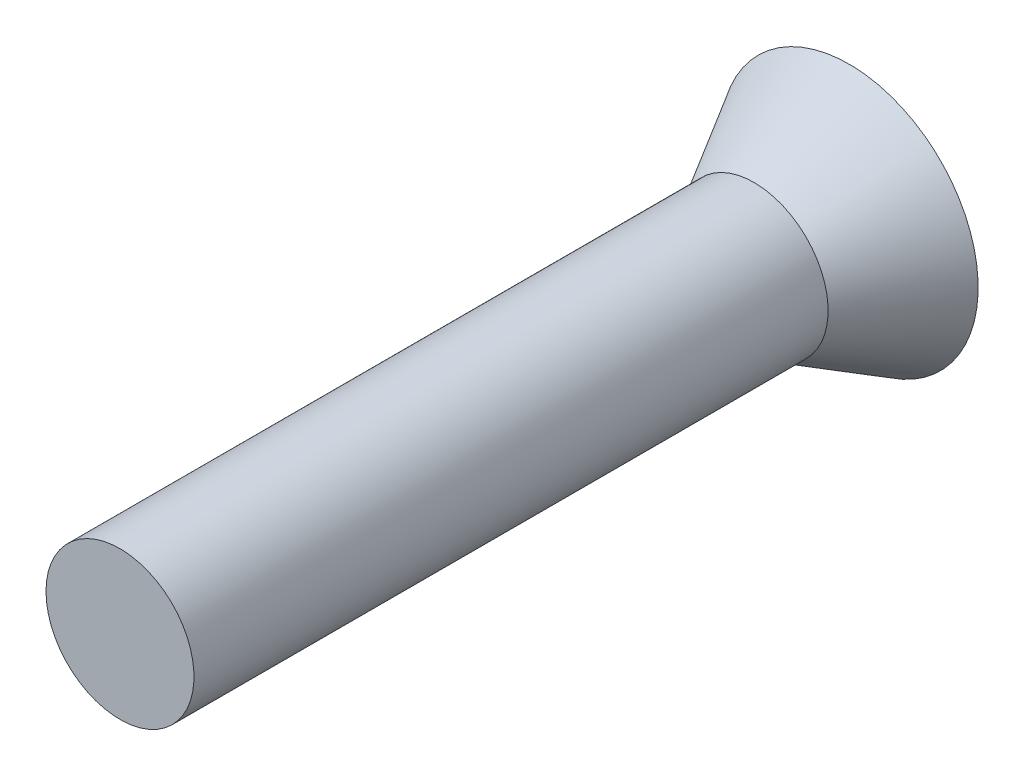
ISO-10303-21;
HEADER;
FILE_DESCRIPTION(('STEP AP214'),'2;1');
FILE_NAME('part.step','',(''),(''),'','','');
FILE_SCHEMA(('AUTOMOTIVE_DESIGN { 1 0 10303 214 1 1 1 1 }'));
ENDSEC;
DATA;
#1=APPLICATION_CONTEXT('core data for automotive mechanical design processes');
#2=APPLICATION_PROTOCOL_DEFINITION('international standard','automotive_design',2000,#1);
#3=PRODUCT_CONTEXT('',#1,'mechanical');
#4=PRODUCT('Part','Part','',(#3));
#5=PRODUCT_RELATED_PRODUCT_CATEGORY('part','',(#4));
#6=PRODUCT_DEFINITION_FORMATION('','',#4);
#7=PRODUCT_DEFINITION_CONTEXT('part definition',#1,'design');
#8=PRODUCT_DEFINITION('design','',#6,#7);
#9=PRODUCT_DEFINITION_SHAPE('','',#8);
#10=(LENGTH_UNIT() NAMED_UNIT(*) SI_UNIT(.MILLI.,.METRE.));
#11=(NAMED_UNIT(*) PLANE_ANGLE_UNIT() SI_UNIT($,.RADIAN.));
#12=(NAMED_UNIT(*) SI_UNIT($,.STERADIAN.) SOLID_ANGLE_UNIT());
#13=UNCERTAINTY_MEASURE_WITH_UNIT(LENGTH_MEASURE(1.E-05),#10,'distance_accuracy_value','');
#14=(GEOMETRIC_REPRESENTATION_CONTEXT(3) GLOBAL_UNCERTAINTY_ASSIGNED_CONTEXT((#13)) GLOBAL_UNIT_ASSIGNED_CONTEXT((#10,
#11,#12)) REPRESENTATION_CONTEXT('',''));
#15=CARTESIAN_POINT('',(0.,0.,0.));
#16=DIRECTION('',(0.,0.,1.));
#17=DIRECTION('',(1.,0.,0.));
#18=AXIS2_PLACEMENT_3D('',#15,#16,#17);
#19=CARTESIAN_POINT('',(-0.699999999999994,0.,1.));
#20=DIRECTION('',(0.,0.,1.));
#21=DIRECTION('',(1.,0.,0.));
#22=AXIS2_PLACEMENT_3D('',#19,#20,#21);
#23=PLANE('',#22);
#24=CARTESIAN_POINT('',(0.,0.,1.));
#25=DIRECTION('',(0.,0.,-1.));
#26=DIRECTION('',(-1.,0.,0.));
#27=AXIS2_PLACEMENT_3D('',#24,#25,#26);
#28=CIRCLE('',#27,0.699999999999994);
#29=CARTESIAN_POINT('',(-0.699999999999994,0.,1.));
#30=VERTEX_POINT('',#29);
#31=EDGE_CURVE('E247',#30,#30,#28,.T.);
#32=ORIENTED_EDGE('',*,*,#31,.F.);
#33=EDGE_LOOP('',(#32));
#34=FACE_BOUND('',#33,.T.);
#35=ADVANCED_FACE('F35',(#34),#23,.T.);
#36=CARTESIAN_POINT('',(0.,0.,-5.9));
#37=DIRECTION('',(0.,0.,-1.));
#38=DIRECTION('',(-1.,0.,0.));
#39=AXIS2_PLACEMENT_3D('',#36,#37,#38);
#40=PLANE('',#39);
#41=DIRECTION('',(0.,-1.,0.));
#42=VECTOR('',#41,1.);
#43=CARTESIAN_POINT('',(0.196763202725732,-0.196763202725732,-5.9));
#44=LINE('',#43,#42);
#45=CARTESIAN_POINT('',(0.196763202725732,-0.296763202725732,-5.9));
#46=VERTEX_POINT('',#45);
#47=CARTESIAN_POINT('',(0.196763202725732,-0.650000000000001,-5.9));
#48=VERTEX_POINT('',#47);
#49=EDGE_CURVE('E213',#46,#48,#44,.T.);
#50=ORIENTED_EDGE('',*,*,#49,.F.);
#51=DIRECTION('',(-0.707106781186551,-0.707106781186544,0.));
#52=VECTOR('',#51,1.);
#53=CARTESIAN_POINT('',(0.246763202725733,-0.246763202725731,-5.9));
#54=LINE('',#53,#52);
#55=CARTESIAN_POINT('',(0.296763202725733,-0.196763202725732,-5.9));
#56=VERTEX_POINT('',#55);
#57=EDGE_CURVE('E196',#46,#56,#54,.F.);
#58=ORIENTED_EDGE('',*,*,#57,.T.);
#59=DIRECTION('',(-1.,0.,0.));
#60=VECTOR('',#59,1.);
#61=CARTESIAN_POINT('',(0.75,-0.196763202725732,-5.9));
#62=LINE('',#61,#60);
#63=CARTESIAN_POINT('',(0.65,-0.196763202725732,-5.9));
#64=VERTEX_POINT('',#63);
#65=EDGE_CURVE('E225',#64,#56,#62,.T.);
#66=ORIENTED_EDGE('',*,*,#65,.F.);
#67=DIRECTION('',(-0.707106781186554,-0.707106781186541,0.));
#68=VECTOR('',#67,1.);
#69=CARTESIAN_POINT('',(0.65,-0.196763202725732,-5.9));
#70=LINE('',#69,#68);
#71=CARTESIAN_POINT('',(0.75,-0.096763202725733,-5.9));
#72=VERTEX_POINT('',#71);
#73=EDGE_CURVE('E317',#64,#72,#70,.F.);
#74=ORIENTED_EDGE('',*,*,#73,.T.);
#75=DIRECTION('',(0.,-1.,0.));
#76=VECTOR('',#75,1.);
#77=CARTESIAN_POINT('',(0.75,0.196763202725732,-5.9));
#78=LINE('',#77,#76);
#79=CARTESIAN_POINT('',(0.75,0.0967632027257305,-5.9));
#80=VERTEX_POINT('',#79);
#81=EDGE_CURVE('E230',#80,#72,#78,.T.);
#82=ORIENTED_EDGE('',*,*,#81,.F.);
#83=DIRECTION('',(0.707106781186541,-0.707106781186554,0.));
#84=VECTOR('',#83,1.);
#85=CARTESIAN_POINT('',(0.75,0.0967632027257305,-5.9));
#86=LINE('',#85,#84);
#87=CARTESIAN_POINT('',(0.650000000000001,0.196763202725732,-5.9));
#88=VERTEX_POINT('',#87);
#89=EDGE_CURVE('E320',#80,#88,#86,.F.);
#90=ORIENTED_EDGE('',*,*,#89,.T.);
#91=DIRECTION('',(1.,0.,0.));
#92=VECTOR('',#91,1.);
#93=CARTESIAN_POINT('',(0.196763202725732,0.196763202725732,-5.9));
#94=LINE('',#93,#92);
#95=CARTESIAN_POINT('',(0.296763202725731,0.196763202725732,-5.9));
#96=VERTEX_POINT('',#95);
#97=EDGE_CURVE('E377',#96,#88,#94,.T.);
#98=ORIENTED_EDGE('',*,*,#97,.F.);
#99=DIRECTION('',(0.707106781186545,-0.70710678118655,0.));
#100=VECTOR('',#99,1.);
#101=CARTESIAN_POINT('',(0.246763202725735,0.246763202725728,-5.9));
#102=LINE('',#101,#100);
#103=CARTESIAN_POINT('',(0.196763202725732,0.296763202725731,-5.9));
#104=VERTEX_POINT('',#103);
#105=EDGE_CURVE('E217',#96,#104,#102,.F.);
#106=ORIENTED_EDGE('',*,*,#105,.T.);
#107=DIRECTION('',(0.,-1.,0.));
#108=VECTOR('',#107,1.);
#109=CARTESIAN_POINT('',(0.196763202725732,0.75,-5.9));
#110=LINE('',#109,#108);
#111=CARTESIAN_POINT('',(0.196763202725732,0.649999999999999,-5.9));
#112=VERTEX_POINT('',#111);
#113=EDGE_CURVE('E374',#112,#104,#110,.T.);
#114=ORIENTED_EDGE('',*,*,#113,.F.);
#115=DIRECTION('',(0.707106781186545,-0.707106781186551,0.));
#116=VECTOR('',#115,1.);
#117=CARTESIAN_POINT('',(0.196763202725732,0.649999999999999,-5.9));
#118=LINE('',#117,#116);
#119=CARTESIAN_POINT('',(0.0967632027257316,0.75,-5.9));
#120=VERTEX_POINT('',#119);
#121=EDGE_CURVE('E322',#112,#120,#118,.F.);
#122=ORIENTED_EDGE('',*,*,#121,.T.);
#123=DIRECTION('',(1.,0.,0.));
#124=VECTOR('',#123,1.);
#125=CARTESIAN_POINT('',(0.,0.75,-5.9));
#126=LINE('',#125,#124);
#127=CARTESIAN_POINT('',(-0.0967632027257307,0.75,-5.9));
#128=VERTEX_POINT('',#127);
#129=EDGE_CURVE('E373',#128,#120,#126,.T.);
#130=ORIENTED_EDGE('',*,*,#129,.F.);
#131=DIRECTION('',(0.707106781186554,0.707106781186541,0.));
#132=VECTOR('',#131,1.);
#133=CARTESIAN_POINT('',(-0.0967632027257307,0.75,-5.9));
#134=LINE('',#133,#132);
#135=CARTESIAN_POINT('',(-0.196763202725732,0.650000000000001,-5.9));
#136=VERTEX_POINT('',#135);
#137=EDGE_CURVE('E325',#128,#136,#134,.F.);
#138=ORIENTED_EDGE('',*,*,#137,.T.);
#139=DIRECTION('',(0.,1.,0.));
#140=VECTOR('',#139,1.);
#141=CARTESIAN_POINT('',(-0.196763202725732,0.196763202725732,-5.9));
#142=LINE('',#141,#140);
#143=CARTESIAN_POINT('',(-0.196763202725732,0.296763202725731,-5.9));
#144=VERTEX_POINT('',#143);
#145=EDGE_CURVE('E243',#144,#136,#142,.T.);
#146=ORIENTED_EDGE('',*,*,#145,.F.);
#147=DIRECTION('',(0.707106781186554,0.707106781186541,0.));
#148=VECTOR('',#147,1.);
#149=CARTESIAN_POINT('',(-0.246763202725727,0.246763202725737,-5.9));
#150=LINE('',#149,#148);
#151=CARTESIAN_POINT('',(-0.296763202725733,0.196763202725732,-5.9));
#152=VERTEX_POINT('',#151);
#153=EDGE_CURVE('E258',#144,#152,#150,.F.);
#154=ORIENTED_EDGE('',*,*,#153,.T.);
#155=DIRECTION('',(1.,0.,0.));
#156=VECTOR('',#155,1.);
#157=CARTESIAN_POINT('',(-0.75,0.196763202725732,-5.9));
#158=LINE('',#157,#156);
#159=CARTESIAN_POINT('',(-0.649999999999999,0.196763202725732,-5.9));
#160=VERTEX_POINT('',#159);
#161=EDGE_CURVE('E241',#160,#152,#158,.T.);
#162=ORIENTED_EDGE('',*,*,#161,.F.);
#163=DIRECTION('',(0.707106781186554,0.707106781186541,0.));
#164=VECTOR('',#163,1.);
#165=CARTESIAN_POINT('',(-0.649999999999999,0.196763202725732,-5.9));
#166=LINE('',#165,#164);
#167=CARTESIAN_POINT('',(-0.75,0.0967632027257323,-5.9));
#168=VERTEX_POINT('',#167);
#169=EDGE_CURVE('E308',#160,#168,#166,.F.);
#170=ORIENTED_EDGE('',*,*,#169,.T.);
#171=DIRECTION('',(0.,1.,0.));
#172=VECTOR('',#171,1.);
#173=CARTESIAN_POINT('',(-0.75,-0.196763202725732,-5.9));
#174=LINE('',#173,#172);
#175=CARTESIAN_POINT('',(-0.75,-0.0967632027257307,-5.9));
#176=VERTEX_POINT('',#175);
#177=EDGE_CURVE('E238',#176,#168,#174,.T.);
#178=ORIENTED_EDGE('',*,*,#177,.F.);
#179=DIRECTION('',(-0.707106781186544,0.707106781186551,0.));
#180=VECTOR('',#179,1.);
#181=CARTESIAN_POINT('',(-0.75,-0.0967632027257307,-5.9));
#182=LINE('',#181,#180);
#183=CARTESIAN_POINT('',(-0.65,-0.196763202725732,-5.9));
#184=VERTEX_POINT('',#183);
#185=EDGE_CURVE('E311',#176,#184,#182,.F.);
#186=ORIENTED_EDGE('',*,*,#185,.T.);
#187=DIRECTION('',(-1.,0.,0.));
#188=VECTOR('',#187,1.);
#189=CARTESIAN_POINT('',(-0.196763202725732,-0.196763202725732,-5.9));
#190=LINE('',#189,#188);
#191=CARTESIAN_POINT('',(-0.296763202725731,-0.196763202725732,-5.9));
#192=VERTEX_POINT('',#191);
#193=EDGE_CURVE('E235',#192,#184,#190,.T.);
#194=ORIENTED_EDGE('',*,*,#193,.F.);
#195=DIRECTION('',(-0.707106781186544,0.707106781186551,0.));
#196=VECTOR('',#195,1.);
#197=CARTESIAN_POINT('',(-0.24676320272573,-0.246763202725733,-5.9));
#198=LINE('',#197,#196);
#199=CARTESIAN_POINT('',(-0.196763202725732,-0.296763202725732,-5.9));
#200=VERTEX_POINT('',#199);
#201=EDGE_CURVE('E206',#192,#200,#198,.F.);
#202=ORIENTED_EDGE('',*,*,#201,.T.);
#203=DIRECTION('',(0.,1.,0.));
#204=VECTOR('',#203,1.);
#205=CARTESIAN_POINT('',(-0.196763202725732,-0.75,-5.9));
#206=LINE('',#205,#204);
#207=CARTESIAN_POINT('',(-0.196763202725732,-0.649999999999999,-5.9));
#208=VERTEX_POINT('',#207);
#209=EDGE_CURVE('E228',#208,#200,#206,.T.);
#210=ORIENTED_EDGE('',*,*,#209,.F.);
#211=DIRECTION('',(-0.707106781186544,0.707106781186551,0.));
#212=VECTOR('',#211,1.);
#213=CARTESIAN_POINT('',(-0.196763202725732,-0.649999999999999,-5.9));
#214=LINE('',#213,#212);
#215=CARTESIAN_POINT('',(-0.0967632027257316,-0.75,-5.9));
#216=VERTEX_POINT('',#215);
#217=EDGE_CURVE('E313',#208,#216,#214,.F.);
#218=ORIENTED_EDGE('',*,*,#217,.T.);
#219=DIRECTION('',(-1.,0.,0.));
#220=VECTOR('',#219,1.);
#221=CARTESIAN_POINT('',(0.196763202725732,-0.75,-5.9));
#222=LINE('',#221,#220);
#223=CARTESIAN_POINT('',(0.0967632027257308,-0.75,-5.9));
#224=VERTEX_POINT('',#223);
#225=EDGE_CURVE('E224',#224,#216,#222,.T.);
#226=ORIENTED_EDGE('',*,*,#225,.F.);
#227=DIRECTION('',(-0.707106781186554,-0.707106781186541,0.));
#228=VECTOR('',#227,1.);
#229=CARTESIAN_POINT('',(0.0967632027257308,-0.75,-5.9));
#230=LINE('',#229,#228);
#231=EDGE_CURVE('E223',#224,#48,#230,.F.);
#232=ORIENTED_EDGE('',*,*,#231,.T.);
#233=EDGE_LOOP('',(#50,#58,#66,#74,#82,#90,#98,#106,#114,#122,#130,#138,#146,#154,#162,#170,
#178,#186,#194,#202,#210,#218,#226,#232));
#234=FACE_BOUND('',#233,.T.);
#235=CARTESIAN_POINT('',(0.,0.,-5.9));
#236=DIRECTION('',(0.,0.,-1.));
#237=DIRECTION('',(-1.,0.,0.));
#238=AXIS2_PLACEMENT_3D('',#235,#236,#237);
#239=CIRCLE('',#238,1.21961524227065);
#240=CARTESIAN_POINT('',(-1.21961524227065,0.,-5.9));
#241=VERTEX_POINT('',#240);
#242=EDGE_CURVE('E218',#241,#241,#239,.T.);
#243=ORIENTED_EDGE('',*,*,#242,.T.);
#244=EDGE_LOOP('',(#243));
#245=FACE_BOUND('',#244,.T.);
#246=ADVANCED_FACE('F220',(#234,#245),#40,.T.);
#247=CARTESIAN_POINT('',(0.,0.,-5.9));
#248=DIRECTION('',(0.,0.,-1.));
#249=DIRECTION('',(-1.,0.,0.));
#250=AXIS2_PLACEMENT_3D('',#247,#248,#249);
#251=CONICAL_SURFACE('',#250,1.21961524227065,0.523598775598291);
#252=CARTESIAN_POINT('',(0.,0.,-5.));
#253=DIRECTION('',(0.,0.,-1.));
#254=DIRECTION('',(-1.,0.,0.));
#255=AXIS2_PLACEMENT_3D('',#252,#253,#254);
#256=CIRCLE('',#255,0.699999999999994);
#257=CARTESIAN_POINT('',(-0.699999999999994,0.,-5.));
#258=VERTEX_POINT('',#257);
#259=EDGE_CURVE('E250',#258,#258,#256,.T.);
#260=ORIENTED_EDGE('',*,*,#259,.T.);
#261=EDGE_LOOP('',(#260));
#262=FACE_BOUND('',#261,.T.);
#263=ORIENTED_EDGE('',*,*,#242,.F.);
#264=EDGE_LOOP('',(#263));
#265=FACE_BOUND('',#264,.T.);
#266=ADVANCED_FACE('F488',(#262,#265),#251,.T.);
#267=CARTESIAN_POINT('',(0.,0.,-52.449576884311));
#268=DIRECTION('',(0.,0.,-1.));
#269=DIRECTION('',(-1.,0.,0.));
#270=AXIS2_PLACEMENT_3D('',#267,#268,#269);
#271=CYLINDRICAL_SURFACE('',#270,0.699999999999994);
#272=ORIENTED_EDGE('',*,*,#31,.T.);
#273=EDGE_LOOP('',(#272));
#274=FACE_BOUND('',#273,.T.);
#275=ORIENTED_EDGE('',*,*,#259,.F.);
#276=EDGE_LOOP('',(#275));
#277=FACE_BOUND('',#276,.T.);
#278=ADVANCED_FACE('F597',(#274,#277),#271,.T.);
#279=CARTESIAN_POINT('',(-0.196763202725732,0.196763202725732,-5.65));
#280=DIRECTION('',(-1.,0.,0.));
#281=DIRECTION('',(0.,-1.,0.));
#282=AXIS2_PLACEMENT_3D('',#279,#280,#281);
#283=PLANE('',#282);
#284=DIRECTION('',(0.,0.,1.));
#285=VECTOR('',#284,1.);
#286=CARTESIAN_POINT('',(-0.196763202725732,0.650000000000001,-5.65));
#287=LINE('',#286,#285);
#288=CARTESIAN_POINT('',(-0.196763202725732,0.650000000000001,-5.8));
#289=VERTEX_POINT('',#288);
#290=EDGE_CURVE('E306',#136,#289,#287,.T.);
#291=ORIENTED_EDGE('',*,*,#290,.T.);
#292=DIRECTION('',(0.,-0.707106781186551,0.707106781186544));
#293=VECTOR('',#292,1.);
#294=CARTESIAN_POINT('',(-0.196763202725732,0.499999999999998,-5.65));
#295=LINE('',#294,#293);
#296=CARTESIAN_POINT('',(-0.196763202725732,0.499999999999998,-5.65));
#297=VERTEX_POINT('',#296);
#298=EDGE_CURVE('E11',#289,#297,#295,.T.);
#299=ORIENTED_EDGE('',*,*,#298,.T.);
#300=DIRECTION('',(0.,1.,0.));
#301=VECTOR('',#300,1.);
#302=CARTESIAN_POINT('',(-0.196763202725732,0.196763202725732,-5.65));
#303=LINE('',#302,#301);
#304=CARTESIAN_POINT('',(-0.196763202725732,0.296763202725731,-5.65));
#305=VERTEX_POINT('',#304);
#306=EDGE_CURVE('E251',#305,#297,#303,.T.);
#307=ORIENTED_EDGE('',*,*,#306,.F.);
#308=DIRECTION('',(0.,0.,-1.));
#309=VECTOR('',#308,1.);
#310=CARTESIAN_POINT('',(-0.196763202725732,0.296763202725731,-5.65));
#311=LINE('',#310,#309);
#312=EDGE_CURVE('E270',#305,#144,#311,.T.);
#313=ORIENTED_EDGE('',*,*,#312,.T.);
#314=ORIENTED_EDGE('',*,*,#145,.T.);
#315=EDGE_LOOP('',(#291,#299,#307,#313,#314));
#316=FACE_BOUND('',#315,.T.);
#317=ADVANCED_FACE('F425',(#316),#283,.F.);
#318=CARTESIAN_POINT('',(-0.75,0.196763202725732,-5.65));
#319=DIRECTION('',(0.,1.,0.));
#320=DIRECTION('',(-1.,0.,0.));
#321=AXIS2_PLACEMENT_3D('',#318,#319,#320);
#322=PLANE('',#321);
#323=DIRECTION('',(1.,0.,0.));
#324=VECTOR('',#323,1.);
#325=CARTESIAN_POINT('',(-0.75,0.196763202725732,-5.65));
#326=LINE('',#325,#324);
#327=CARTESIAN_POINT('',(-0.499999999999998,0.196763202725732,-5.65));
#328=VERTEX_POINT('',#327);
#329=CARTESIAN_POINT('',(-0.296763202725733,0.196763202725732,-5.65));
#330=VERTEX_POINT('',#329);
#331=EDGE_CURVE('E417',#328,#330,#326,.T.);
#332=ORIENTED_EDGE('',*,*,#331,.F.);
#333=DIRECTION('',(-0.707106781186551,0.,-0.707106781186544));
#334=VECTOR('',#333,1.);
#335=CARTESIAN_POINT('',(-0.499999999999998,0.196763202725732,-5.65));
#336=LINE('',#335,#334);
#337=CARTESIAN_POINT('',(-0.649999999999999,0.196763202725732,-5.8));
#338=VERTEX_POINT('',#337);
#339=EDGE_CURVE('E355',#328,#338,#336,.T.);
#340=ORIENTED_EDGE('',*,*,#339,.T.);
#341=DIRECTION('',(0.,0.,-1.));
#342=VECTOR('',#341,1.);
#343=CARTESIAN_POINT('',(-0.649999999999999,0.196763202725732,-5.9));
#344=LINE('',#343,#342);
#345=EDGE_CURVE('E290',#338,#160,#344,.T.);
#346=ORIENTED_EDGE('',*,*,#345,.T.);
#347=ORIENTED_EDGE('',*,*,#161,.T.);
#348=DIRECTION('',(0.,0.,1.));
#349=VECTOR('',#348,1.);
#350=CARTESIAN_POINT('',(-0.296763202725733,0.196763202725732,-5.65));
#351=LINE('',#350,#349);
#352=EDGE_CURVE('E273',#152,#330,#351,.T.);
#353=ORIENTED_EDGE('',*,*,#352,.T.);
#354=EDGE_LOOP('',(#332,#340,#346,#347,#353));
#355=FACE_BOUND('',#354,.T.);
#356=ADVANCED_FACE('F433',(#355),#322,.F.);
#357=CARTESIAN_POINT('',(-0.196763202725732,-0.196763202725732,-5.65));
#358=DIRECTION('',(0.,-1.,0.));
#359=DIRECTION('',(1.,0.,0.));
#360=AXIS2_PLACEMENT_3D('',#357,#358,#359);
#361=PLANE('',#360);
#362=DIRECTION('',(0.,0.,1.));
#363=VECTOR('',#362,1.);
#364=CARTESIAN_POINT('',(-0.65,-0.196763202725732,-5.65));
#365=LINE('',#364,#363);
#366=CARTESIAN_POINT('',(-0.65,-0.196763202725732,-5.8));
#367=VERTEX_POINT('',#366);
#368=EDGE_CURVE('E292',#184,#367,#365,.T.);
#369=ORIENTED_EDGE('',*,*,#368,.T.);
#370=DIRECTION('',(0.707106781186551,0.,0.707106781186544));
#371=VECTOR('',#370,1.);
#372=CARTESIAN_POINT('',(-0.499999999999998,-0.196763202725732,-5.65));
#373=LINE('',#372,#371);
#374=CARTESIAN_POINT('',(-0.499999999999998,-0.196763202725732,-5.65));
#375=VERTEX_POINT('',#374);
#376=EDGE_CURVE('E361',#367,#375,#373,.T.);
#377=ORIENTED_EDGE('',*,*,#376,.T.);
#378=DIRECTION('',(-1.,0.,0.));
#379=VECTOR('',#378,1.);
#380=CARTESIAN_POINT('',(-0.196763202725732,-0.196763202725732,-5.65));
#381=LINE('',#380,#379);
#382=CARTESIAN_POINT('',(-0.296763202725731,-0.196763202725732,-5.65));
#383=VERTEX_POINT('',#382);
#384=EDGE_CURVE('E415',#383,#375,#381,.T.);
#385=ORIENTED_EDGE('',*,*,#384,.F.);
#386=DIRECTION('',(0.,0.,-1.));
#387=VECTOR('',#386,1.);
#388=CARTESIAN_POINT('',(-0.296763202725731,-0.196763202725732,-5.65));
#389=LINE('',#388,#387);
#390=EDGE_CURVE('E264',#383,#192,#389,.T.);
#391=ORIENTED_EDGE('',*,*,#390,.T.);
#392=ORIENTED_EDGE('',*,*,#193,.T.);
#393=EDGE_LOOP('',(#369,#377,#385,#391,#392));
#394=FACE_BOUND('',#393,.T.);
#395=ADVANCED_FACE('F449',(#394),#361,.F.);
#396=CARTESIAN_POINT('',(-0.196763202725732,-0.75,-5.65));
#397=DIRECTION('',(-1.,0.,0.));
#398=DIRECTION('',(0.,-1.,0.));
#399=AXIS2_PLACEMENT_3D('',#396,#397,#398);
#400=PLANE('',#399);
#401=DIRECTION('',(0.,1.,0.));
#402=VECTOR('',#401,1.);
#403=CARTESIAN_POINT('',(-0.196763202725732,-0.75,-5.65));
#404=LINE('',#403,#402);
#405=CARTESIAN_POINT('',(-0.196763202725732,-0.499999999999998,-5.65));
#406=VERTEX_POINT('',#405);
#407=CARTESIAN_POINT('',(-0.196763202725732,-0.296763202725732,-5.65));
#408=VERTEX_POINT('',#407);
#409=EDGE_CURVE('E413',#406,#408,#404,.T.);
#410=ORIENTED_EDGE('',*,*,#409,.F.);
#411=DIRECTION('',(0.,-0.707106781186551,-0.707106781186544));
#412=VECTOR('',#411,1.);
#413=CARTESIAN_POINT('',(-0.196763202725732,-0.499999999999998,-5.65));
#414=LINE('',#413,#412);
#415=CARTESIAN_POINT('',(-0.196763202725732,-0.649999999999999,-5.8));
#416=VERTEX_POINT('',#415);
#417=EDGE_CURVE('E339',#406,#416,#414,.T.);
#418=ORIENTED_EDGE('',*,*,#417,.T.);
#419=DIRECTION('',(0.,0.,-1.));
#420=VECTOR('',#419,1.);
#421=CARTESIAN_POINT('',(-0.196763202725732,-0.649999999999999,-5.9));
#422=LINE('',#421,#420);
#423=EDGE_CURVE('E295',#416,#208,#422,.T.);
#424=ORIENTED_EDGE('',*,*,#423,.T.);
#425=ORIENTED_EDGE('',*,*,#209,.T.);
#426=DIRECTION('',(0.,0.,1.));
#427=VECTOR('',#426,1.);
#428=CARTESIAN_POINT('',(-0.196763202725732,-0.296763202725732,-5.65));
#429=LINE('',#428,#427);
#430=EDGE_CURVE('E267',#200,#408,#429,.T.);
#431=ORIENTED_EDGE('',*,*,#430,.T.);
#432=EDGE_LOOP('',(#410,#418,#424,#425,#431));
#433=FACE_BOUND('',#432,.T.);
#434=ADVANCED_FACE('F460',(#433),#400,.F.);
#435=CARTESIAN_POINT('',(0.196763202725732,-0.196763202725732,-5.65));
#436=DIRECTION('',(1.,0.,0.));
#437=DIRECTION('',(0.,1.,0.));
#438=AXIS2_PLACEMENT_3D('',#435,#436,#437);
#439=PLANE('',#438);
#440=DIRECTION('',(0.,0.,1.));
#441=VECTOR('',#440,1.);
#442=CARTESIAN_POINT('',(0.196763202725732,-0.650000000000001,-5.65));
#443=LINE('',#442,#441);
#444=CARTESIAN_POINT('',(0.196763202725732,-0.650000000000001,-5.8));
#445=VERTEX_POINT('',#444);
#446=EDGE_CURVE('E297',#48,#445,#443,.T.);
#447=ORIENTED_EDGE('',*,*,#446,.T.);
#448=DIRECTION('',(0.,0.707106781186551,0.707106781186544));
#449=VECTOR('',#448,1.);
#450=CARTESIAN_POINT('',(0.196763202725732,-0.499999999999998,-5.65));
#451=LINE('',#450,#449);
#452=CARTESIAN_POINT('',(0.196763202725732,-0.499999999999998,-5.65));
#453=VERTEX_POINT('',#452);
#454=EDGE_CURVE('E345',#445,#453,#451,.T.);
#455=ORIENTED_EDGE('',*,*,#454,.T.);
#456=DIRECTION('',(0.,-1.,0.));
#457=VECTOR('',#456,1.);
#458=CARTESIAN_POINT('',(0.196763202725732,-0.196763202725732,-5.65));
#459=LINE('',#458,#457);
#460=CARTESIAN_POINT('',(0.196763202725732,-0.296763202725732,-5.65));
#461=VERTEX_POINT('',#460);
#462=EDGE_CURVE('E216',#461,#453,#459,.T.);
#463=ORIENTED_EDGE('',*,*,#462,.F.);
#464=DIRECTION('',(0.,0.,-1.));
#465=VECTOR('',#464,1.);
#466=CARTESIAN_POINT('',(0.196763202725732,-0.296763202725732,-5.65));
#467=LINE('',#466,#465);
#468=EDGE_CURVE('E200',#461,#46,#467,.T.);
#469=ORIENTED_EDGE('',*,*,#468,.T.);
#470=ORIENTED_EDGE('',*,*,#49,.T.);
#471=EDGE_LOOP('',(#447,#455,#463,#469,#470));
#472=FACE_BOUND('',#471,.T.);
#473=ADVANCED_FACE('F212',(#472),#439,.F.);
#474=CARTESIAN_POINT('',(0.75,-0.196763202725732,-5.65));
#475=DIRECTION('',(0.,-1.,0.));
#476=DIRECTION('',(1.,0.,0.));
#477=AXIS2_PLACEMENT_3D('',#474,#475,#476);
#478=PLANE('',#477);
#479=DIRECTION('',(-1.,0.,0.));
#480=VECTOR('',#479,1.);
#481=CARTESIAN_POINT('',(0.75,-0.196763202725732,-5.65));
#482=LINE('',#481,#480);
#483=CARTESIAN_POINT('',(0.499999999999998,-0.196763202725732,-5.65));
#484=VERTEX_POINT('',#483);
#485=CARTESIAN_POINT('',(0.296763202725733,-0.196763202725732,-5.65));
#486=VERTEX_POINT('',#485);
#487=EDGE_CURVE('E398',#484,#486,#482,.T.);
#488=ORIENTED_EDGE('',*,*,#487,.F.);
#489=DIRECTION('',(0.707106781186551,0.,-0.707106781186544));
#490=VECTOR('',#489,1.);
#491=CARTESIAN_POINT('',(0.499999999999998,-0.196763202725732,-5.65));
#492=LINE('',#491,#490);
#493=CARTESIAN_POINT('',(0.65,-0.196763202725732,-5.8));
#494=VERTEX_POINT('',#493);
#495=EDGE_CURVE('E347',#484,#494,#492,.T.);
#496=ORIENTED_EDGE('',*,*,#495,.T.);
#497=DIRECTION('',(0.,0.,-1.));
#498=VECTOR('',#497,1.);
#499=CARTESIAN_POINT('',(0.65,-0.196763202725732,-5.9));
#500=LINE('',#499,#498);
#501=EDGE_CURVE('E299',#494,#64,#500,.T.);
#502=ORIENTED_EDGE('',*,*,#501,.T.);
#503=ORIENTED_EDGE('',*,*,#65,.T.);
#504=DIRECTION('',(0.,0.,1.));
#505=VECTOR('',#504,1.);
#506=CARTESIAN_POINT('',(0.296763202725733,-0.196763202725732,-5.65));
#507=LINE('',#506,#505);
#508=EDGE_CURVE('E202',#56,#486,#507,.T.);
#509=ORIENTED_EDGE('',*,*,#508,.T.);
#510=EDGE_LOOP('',(#488,#496,#502,#503,#509));
#511=FACE_BOUND('',#510,.T.);
#512=ADVANCED_FACE('F397',(#511),#478,.F.);
#513=CARTESIAN_POINT('',(0.196763202725732,0.196763202725732,-5.65));
#514=DIRECTION('',(0.,1.,0.));
#515=DIRECTION('',(-1.,0.,0.));
#516=AXIS2_PLACEMENT_3D('',#513,#514,#515);
#517=PLANE('',#516);
#518=DIRECTION('',(0.,0.,1.));
#519=VECTOR('',#518,1.);
#520=CARTESIAN_POINT('',(0.650000000000001,0.196763202725732,-5.65));
#521=LINE('',#520,#519);
#522=CARTESIAN_POINT('',(0.650000000000001,0.196763202725732,-5.8));
#523=VERTEX_POINT('',#522);
#524=EDGE_CURVE('E301',#88,#523,#521,.T.);
#525=ORIENTED_EDGE('',*,*,#524,.T.);
#526=DIRECTION('',(-0.707106781186551,0.,0.707106781186544));
#527=VECTOR('',#526,1.);
#528=CARTESIAN_POINT('',(0.499999999999998,0.196763202725732,-5.65));
#529=LINE('',#528,#527);
#530=CARTESIAN_POINT('',(0.499999999999998,0.196763202725732,-5.65));
#531=VERTEX_POINT('',#530);
#532=EDGE_CURVE('E353',#523,#531,#529,.T.);
#533=ORIENTED_EDGE('',*,*,#532,.T.);
#534=DIRECTION('',(1.,0.,0.));
#535=VECTOR('',#534,1.);
#536=CARTESIAN_POINT('',(0.196763202725732,0.196763202725732,-5.65));
#537=LINE('',#536,#535);
#538=CARTESIAN_POINT('',(0.29676320272573,0.196763202725732,-5.65));
#539=VERTEX_POINT('',#538);
#540=EDGE_CURVE('E404',#539,#531,#537,.T.);
#541=ORIENTED_EDGE('',*,*,#540,.F.);
#542=DIRECTION('',(0.,0.,-1.));
#543=VECTOR('',#542,1.);
#544=CARTESIAN_POINT('',(0.29676320272573,0.196763202725732,-5.65));
#545=LINE('',#544,#543);
#546=EDGE_CURVE('E276',#539,#96,#545,.T.);
#547=ORIENTED_EDGE('',*,*,#546,.T.);
#548=ORIENTED_EDGE('',*,*,#97,.T.);
#549=EDGE_LOOP('',(#525,#533,#541,#547,#548));
#550=FACE_BOUND('',#549,.T.);
#551=ADVANCED_FACE('F584',(#550),#517,.F.);
#552=CARTESIAN_POINT('',(0.196763202725732,0.75,-5.65));
#553=DIRECTION('',(1.,0.,0.));
#554=DIRECTION('',(0.,1.,0.));
#555=AXIS2_PLACEMENT_3D('',#552,#553,#554);
#556=PLANE('',#555);
#557=DIRECTION('',(0.,-1.,0.));
#558=VECTOR('',#557,1.);
#559=CARTESIAN_POINT('',(0.196763202725732,0.75,-5.65));
#560=LINE('',#559,#558);
#561=CARTESIAN_POINT('',(0.196763202725732,0.499999999999998,-5.65));
#562=VERTEX_POINT('',#561);
#563=CARTESIAN_POINT('',(0.196763202725732,0.296763202725731,-5.65));
#564=VERTEX_POINT('',#563);
#565=EDGE_CURVE('E246',#562,#564,#560,.T.);
#566=ORIENTED_EDGE('',*,*,#565,.F.);
#567=DIRECTION('',(0.,0.707106781186551,-0.707106781186544));
#568=VECTOR('',#567,1.);
#569=CARTESIAN_POINT('',(0.196763202725732,0.499999999999998,-5.65));
#570=LINE('',#569,#568);
#571=CARTESIAN_POINT('',(0.196763202725732,0.649999999999999,-5.8));
#572=VERTEX_POINT('',#571);
#573=EDGE_CURVE('E57',#562,#572,#570,.T.);
#574=ORIENTED_EDGE('',*,*,#573,.T.);
#575=DIRECTION('',(0.,0.,-1.));
#576=VECTOR('',#575,1.);
#577=CARTESIAN_POINT('',(0.196763202725732,0.649999999999999,-5.9));
#578=LINE('',#577,#576);
#579=EDGE_CURVE('E304',#572,#112,#578,.T.);
#580=ORIENTED_EDGE('',*,*,#579,.T.);
#581=ORIENTED_EDGE('',*,*,#113,.T.);
#582=DIRECTION('',(0.,0.,1.));
#583=VECTOR('',#582,1.);
#584=CARTESIAN_POINT('',(0.196763202725732,0.296763202725731,-5.65));
#585=LINE('',#584,#583);
#586=EDGE_CURVE('E279',#104,#564,#585,.T.);
#587=ORIENTED_EDGE('',*,*,#586,.T.);
#588=EDGE_LOOP('',(#566,#574,#580,#581,#587));
#589=FACE_BOUND('',#588,.T.);
#590=ADVANCED_FACE('F586',(#589),#556,.F.);
#591=CARTESIAN_POINT('',(0.,0.,-5.65));
#592=DIRECTION('',(0.,0.,-1.));
#593=DIRECTION('',(-1.,0.,0.));
#594=AXIS2_PLACEMENT_3D('',#591,#592,#593);
#595=PLANE('',#594);
#596=ORIENTED_EDGE('',*,*,#462,.T.);
#597=DIRECTION('',(-1.,0.,0.));
#598=VECTOR('',#597,1.);
#599=CARTESIAN_POINT('',(0.,-0.499999999999998,-5.65));
#600=LINE('',#599,#598);
#601=EDGE_CURVE('E336',#453,#406,#600,.T.);
#602=ORIENTED_EDGE('',*,*,#601,.T.);
#603=ORIENTED_EDGE('',*,*,#409,.T.);
#604=DIRECTION('',(0.707106781186544,-0.707106781186551,0.));
#605=VECTOR('',#604,1.);
#606=CARTESIAN_POINT('',(-0.296763202725731,-0.196763202725732,-5.65));
#607=LINE('',#606,#605);
#608=EDGE_CURVE('E284',#408,#383,#607,.F.);
#609=ORIENTED_EDGE('',*,*,#608,.T.);
#610=ORIENTED_EDGE('',*,*,#384,.T.);
#611=DIRECTION('',(0.,1.,0.));
#612=VECTOR('',#611,1.);
#613=CARTESIAN_POINT('',(-0.499999999999998,0.,-5.65));
#614=LINE('',#613,#612);
#615=EDGE_CURVE('E330',#375,#328,#614,.T.);
#616=ORIENTED_EDGE('',*,*,#615,.T.);
#617=ORIENTED_EDGE('',*,*,#331,.T.);
#618=DIRECTION('',(-0.707106781186554,-0.707106781186541,0.));
#619=VECTOR('',#618,1.);
#620=CARTESIAN_POINT('',(-0.196763202725732,0.296763202725731,-5.65));
#621=LINE('',#620,#619);
#622=EDGE_CURVE('E286',#330,#305,#621,.F.);
#623=ORIENTED_EDGE('',*,*,#622,.T.);
#624=ORIENTED_EDGE('',*,*,#306,.T.);
#625=DIRECTION('',(1.,0.,0.));
#626=VECTOR('',#625,1.);
#627=CARTESIAN_POINT('',(0.,0.499999999999998,-5.65));
#628=LINE('',#627,#626);
#629=EDGE_CURVE('E327',#297,#562,#628,.T.);
#630=ORIENTED_EDGE('',*,*,#629,.T.);
#631=ORIENTED_EDGE('',*,*,#565,.T.);
#632=DIRECTION('',(-0.707106781186545,0.70710678118655,0.));
#633=VECTOR('',#632,1.);
#634=CARTESIAN_POINT('',(0.29676320272573,0.196763202725732,-5.65));
#635=LINE('',#634,#633);
#636=EDGE_CURVE('E288',#564,#539,#635,.F.);
#637=ORIENTED_EDGE('',*,*,#636,.T.);
#638=ORIENTED_EDGE('',*,*,#540,.T.);
#639=DIRECTION('',(0.,-1.,0.));
#640=VECTOR('',#639,1.);
#641=CARTESIAN_POINT('',(0.499999999999998,0.,-5.65));
#642=LINE('',#641,#640);
#643=EDGE_CURVE('E333',#531,#484,#642,.T.);
#644=ORIENTED_EDGE('',*,*,#643,.T.);
#645=ORIENTED_EDGE('',*,*,#487,.T.);
#646=DIRECTION('',(0.707106781186551,0.707106781186544,0.));
#647=VECTOR('',#646,1.);
#648=CARTESIAN_POINT('',(0.196763202725732,-0.296763202725732,-5.65));
#649=LINE('',#648,#647);
#650=EDGE_CURVE('E282',#486,#461,#649,.F.);
#651=ORIENTED_EDGE('',*,*,#650,.T.);
#652=EDGE_LOOP('',(#596,#602,#603,#609,#610,#616,#617,#623,#624,#630,#631,#637,#638,#644,#645,#651));
#653=FACE_BOUND('',#652,.T.);
#654=ADVANCED_FACE('F402',(#653),#595,.T.);
#655=CARTESIAN_POINT('',(0.196763202725732,-0.296763202725732,-5.65));
#656=DIRECTION('',(0.707106781186544,-0.707106781186551,0.));
#657=DIRECTION('',(0.,0.,-1.));
#658=AXIS2_PLACEMENT_3D('',#655,#656,#657);
#659=PLANE('',#658);
#660=ORIENTED_EDGE('',*,*,#650,.F.);
#661=ORIENTED_EDGE('',*,*,#508,.F.);
#662=ORIENTED_EDGE('',*,*,#57,.F.);
#663=ORIENTED_EDGE('',*,*,#468,.F.);
#664=EDGE_LOOP('',(#660,#661,#662,#663));
#665=FACE_BOUND('',#664,.T.);
#666=ADVANCED_FACE('F199',(#665),#659,.F.);
#667=CARTESIAN_POINT('',(-0.296763202725731,-0.196763202725732,-5.65));
#668=DIRECTION('',(-0.707106781186551,-0.707106781186544,0.));
#669=DIRECTION('',(0.,0.,-1.));
#670=AXIS2_PLACEMENT_3D('',#667,#668,#669);
#671=PLANE('',#670);
#672=ORIENTED_EDGE('',*,*,#608,.F.);
#673=ORIENTED_EDGE('',*,*,#430,.F.);
#674=ORIENTED_EDGE('',*,*,#201,.F.);
#675=ORIENTED_EDGE('',*,*,#390,.F.);
#676=EDGE_LOOP('',(#672,#673,#674,#675));
#677=FACE_BOUND('',#676,.T.);
#678=ADVANCED_FACE('F457',(#677),#671,.F.);
#679=CARTESIAN_POINT('',(-0.196763202725732,0.296763202725731,-5.65));
#680=DIRECTION('',(-0.707106781186541,0.707106781186554,0.));
#681=DIRECTION('',(0.,0.,-1.));
#682=AXIS2_PLACEMENT_3D('',#679,#680,#681);
#683=PLANE('',#682);
#684=ORIENTED_EDGE('',*,*,#622,.F.);
#685=ORIENTED_EDGE('',*,*,#352,.F.);
#686=ORIENTED_EDGE('',*,*,#153,.F.);
#687=ORIENTED_EDGE('',*,*,#312,.F.);
#688=EDGE_LOOP('',(#684,#685,#686,#687));
#689=FACE_BOUND('',#688,.T.);
#690=ADVANCED_FACE('F431',(#689),#683,.F.);
#691=CARTESIAN_POINT('',(0.29676320272573,0.196763202725732,-5.65));
#692=DIRECTION('',(0.707106781186551,0.707106781186545,0.));
#693=DIRECTION('',(0.,0.,-1.));
#694=AXIS2_PLACEMENT_3D('',#691,#692,#693);
#695=PLANE('',#694);
#696=ORIENTED_EDGE('',*,*,#636,.F.);
#697=ORIENTED_EDGE('',*,*,#586,.F.);
#698=ORIENTED_EDGE('',*,*,#105,.F.);
#699=ORIENTED_EDGE('',*,*,#546,.F.);
#700=EDGE_LOOP('',(#696,#697,#698,#699));
#701=FACE_BOUND('',#700,.T.);
#702=ADVANCED_FACE('F499',(#701),#695,.F.);
#703=CARTESIAN_POINT('',(-0.649999999999999,0.196763202725732,-5.65));
#704=DIRECTION('',(0.707106781186541,-0.707106781186554,0.));
#705=DIRECTION('',(0.,0.,1.));
#706=AXIS2_PLACEMENT_3D('',#703,#704,#705);
#707=PLANE('',#706);
#708=ORIENTED_EDGE('',*,*,#345,.F.);
#709=DIRECTION('',(0.577350269189631,0.577350269189621,0.577350269189625));
#710=VECTOR('',#709,1.);
#711=CARTESIAN_POINT('',(-0.615587734241908,0.231175468483822,-5.76558773424191));
#712=LINE('',#711,#710);
#713=EDGE_CURVE('E357',#338,#168,#712,.F.);
#714=ORIENTED_EDGE('',*,*,#713,.T.);
#715=ORIENTED_EDGE('',*,*,#169,.F.);
#716=EDGE_LOOP('',(#708,#714,#715));
#717=FACE_BOUND('',#716,.T.);
#718=ADVANCED_FACE('F438',(#717),#707,.T.);
#719=CARTESIAN_POINT('',(-0.75,-0.0967632027257307,-5.65));
#720=DIRECTION('',(0.707106781186551,0.707106781186544,0.));
#721=DIRECTION('',(0.,0.,1.));
#722=AXIS2_PLACEMENT_3D('',#719,#720,#721);
#723=PLANE('',#722);
#724=ORIENTED_EDGE('',*,*,#185,.F.);
#725=DIRECTION('',(-0.577350269189626,0.577350269189631,-0.57735026918962));
#726=VECTOR('',#725,1.);
#727=CARTESIAN_POINT('',(-0.615587734241911,-0.231175468483821,-5.76558773424191));
#728=LINE('',#727,#726);
#729=EDGE_CURVE('E359',#176,#367,#728,.F.);
#730=ORIENTED_EDGE('',*,*,#729,.T.);
#731=ORIENTED_EDGE('',*,*,#368,.F.);
#732=EDGE_LOOP('',(#724,#730,#731));
#733=FACE_BOUND('',#732,.T.);
#734=ADVANCED_FACE('F447',(#733),#723,.T.);
#735=CARTESIAN_POINT('',(-0.196763202725732,-0.649999999999999,-5.65));
#736=DIRECTION('',(0.707106781186551,0.707106781186544,0.));
#737=DIRECTION('',(0.,0.,1.));
#738=AXIS2_PLACEMENT_3D('',#735,#736,#737);
#739=PLANE('',#738);
#740=ORIENTED_EDGE('',*,*,#423,.F.);
#741=DIRECTION('',(-0.577350269189624,0.57735026918963,0.577350269189624));
#742=VECTOR('',#741,1.);
#743=CARTESIAN_POINT('',(-0.231175468483821,-0.615587734241909,-5.76558773424191));
#744=LINE('',#743,#742);
#745=EDGE_CURVE('E341',#416,#216,#744,.F.);
#746=ORIENTED_EDGE('',*,*,#745,.T.);
#747=ORIENTED_EDGE('',*,*,#217,.F.);
#748=EDGE_LOOP('',(#740,#746,#747));
#749=FACE_BOUND('',#748,.T.);
#750=ADVANCED_FACE('F465',(#749),#739,.T.);
#751=CARTESIAN_POINT('',(0.0967632027257308,-0.75,-5.65));
#752=DIRECTION('',(-0.707106781186541,0.707106781186554,0.));
#753=DIRECTION('',(0.,0.,1.));
#754=AXIS2_PLACEMENT_3D('',#751,#752,#753);
#755=PLANE('',#754);
#756=ORIENTED_EDGE('',*,*,#231,.F.);
#757=DIRECTION('',(-0.577350269189635,-0.577350269189624,-0.577350269189618));
#758=VECTOR('',#757,1.);
#759=CARTESIAN_POINT('',(0.231175468483821,-0.615587734241912,-5.76558773424191));
#760=LINE('',#759,#758);
#761=EDGE_CURVE('E343',#224,#445,#760,.F.);
#762=ORIENTED_EDGE('',*,*,#761,.T.);
#763=ORIENTED_EDGE('',*,*,#446,.F.);
#764=EDGE_LOOP('',(#756,#762,#763));
#765=FACE_BOUND('',#764,.T.);
#766=ADVANCED_FACE('F472',(#765),#755,.T.);
#767=CARTESIAN_POINT('',(0.65,-0.196763202725732,-5.65));
#768=DIRECTION('',(-0.707106781186541,0.707106781186554,0.));
#769=DIRECTION('',(0.,0.,1.));
#770=AXIS2_PLACEMENT_3D('',#767,#768,#769);
#771=PLANE('',#770);
#772=ORIENTED_EDGE('',*,*,#501,.F.);
#773=DIRECTION('',(-0.577350269189631,-0.577350269189621,0.577350269189625));
#774=VECTOR('',#773,1.);
#775=CARTESIAN_POINT('',(0.615587734241908,-0.231175468483822,-5.76558773424191));
#776=LINE('',#775,#774);
#777=EDGE_CURVE('E349',#494,#72,#776,.F.);
#778=ORIENTED_EDGE('',*,*,#777,.T.);
#779=ORIENTED_EDGE('',*,*,#73,.F.);
#780=EDGE_LOOP('',(#772,#778,#779));
#781=FACE_BOUND('',#780,.T.);
#782=ADVANCED_FACE('F394',(#781),#771,.T.);
#783=CARTESIAN_POINT('',(0.75,0.0967632027257305,-5.65));
#784=DIRECTION('',(-0.707106781186554,-0.707106781186541,0.));
#785=DIRECTION('',(0.,0.,1.));
#786=AXIS2_PLACEMENT_3D('',#783,#784,#785);
#787=PLANE('',#786);
#788=ORIENTED_EDGE('',*,*,#89,.F.);
#789=DIRECTION('',(0.577350269189624,-0.577350269189635,-0.577350269189618));
#790=VECTOR('',#789,1.);
#791=CARTESIAN_POINT('',(0.615587734241912,0.231175468483821,-5.76558773424191));
#792=LINE('',#791,#790);
#793=EDGE_CURVE('E351',#80,#523,#792,.F.);
#794=ORIENTED_EDGE('',*,*,#793,.T.);
#795=ORIENTED_EDGE('',*,*,#524,.F.);
#796=EDGE_LOOP('',(#788,#794,#795));
#797=FACE_BOUND('',#796,.T.);
#798=ADVANCED_FACE('F479',(#797),#787,.T.);
#799=CARTESIAN_POINT('',(0.196763202725732,0.649999999999999,-5.65));
#800=DIRECTION('',(-0.707106781186551,-0.707106781186545,0.));
#801=DIRECTION('',(0.,0.,1.));
#802=AXIS2_PLACEMENT_3D('',#799,#800,#801);
#803=PLANE('',#802);
#804=ORIENTED_EDGE('',*,*,#579,.F.);
#805=DIRECTION('',(0.577350269189625,-0.57735026918963,0.577350269189623));
#806=VECTOR('',#805,1.);
#807=CARTESIAN_POINT('',(0.231175468483822,0.615587734241909,-5.76558773424191));
#808=LINE('',#807,#806);
#809=EDGE_CURVE('E364',#572,#120,#808,.F.);
#810=ORIENTED_EDGE('',*,*,#809,.T.);
#811=ORIENTED_EDGE('',*,*,#121,.F.);
#812=EDGE_LOOP('',(#804,#810,#811));
#813=FACE_BOUND('',#812,.T.);
#814=ADVANCED_FACE('F368',(#813),#803,.T.);
#815=CARTESIAN_POINT('',(-0.0967632027257307,0.75,-5.65));
#816=DIRECTION('',(0.707106781186541,-0.707106781186554,0.));
#817=DIRECTION('',(0.,0.,1.));
#818=AXIS2_PLACEMENT_3D('',#815,#816,#817);
#819=PLANE('',#818);
#820=ORIENTED_EDGE('',*,*,#137,.F.);
#821=DIRECTION('',(0.577350269189634,0.577350269189624,-0.577350269189619));
#822=VECTOR('',#821,1.);
#823=CARTESIAN_POINT('',(-0.231175468483821,0.615587734241912,-5.76558773424191));
#824=LINE('',#823,#822);
#825=EDGE_CURVE('E43',#128,#289,#824,.F.);
#826=ORIENTED_EDGE('',*,*,#825,.T.);
#827=ORIENTED_EDGE('',*,*,#290,.F.);
#828=EDGE_LOOP('',(#820,#826,#827));
#829=FACE_BOUND('',#828,.T.);
#830=ADVANCED_FACE('F427',(#829),#819,.T.);
#831=CARTESIAN_POINT('',(0.,-0.499999999999998,-5.65));
#832=DIRECTION('',(0.,-0.707106781186544,0.707106781186551));
#833=DIRECTION('',(-1.,0.,0.));
#834=AXIS2_PLACEMENT_3D('',#831,#832,#833);
#835=PLANE('',#834);
#836=ORIENTED_EDGE('',*,*,#761,.F.);
#837=ORIENTED_EDGE('',*,*,#225,.T.);
#838=ORIENTED_EDGE('',*,*,#745,.F.);
#839=ORIENTED_EDGE('',*,*,#417,.F.);
#840=ORIENTED_EDGE('',*,*,#601,.F.);
#841=ORIENTED_EDGE('',*,*,#454,.F.);
#842=EDGE_LOOP('',(#836,#837,#838,#839,#840,#841));
#843=FACE_BOUND('',#842,.T.);
#844=ADVANCED_FACE('F468',(#843),#835,.F.);
#845=CARTESIAN_POINT('',(0.499999999999998,0.,-5.65));
#846=DIRECTION('',(0.707106781186544,0.,0.707106781186551));
#847=DIRECTION('',(0.,-1.,0.));
#848=AXIS2_PLACEMENT_3D('',#845,#846,#847);
#849=PLANE('',#848);
#850=ORIENTED_EDGE('',*,*,#793,.F.);
#851=ORIENTED_EDGE('',*,*,#81,.T.);
#852=ORIENTED_EDGE('',*,*,#777,.F.);
#853=ORIENTED_EDGE('',*,*,#495,.F.);
#854=ORIENTED_EDGE('',*,*,#643,.F.);
#855=ORIENTED_EDGE('',*,*,#532,.F.);
#856=EDGE_LOOP('',(#850,#851,#852,#853,#854,#855));
#857=FACE_BOUND('',#856,.T.);
#858=ADVANCED_FACE('F388',(#857),#849,.F.);
#859=CARTESIAN_POINT('',(-0.499999999999998,0.,-5.65));
#860=DIRECTION('',(-0.707106781186544,0.,0.707106781186551));
#861=DIRECTION('',(0.,1.,0.));
#862=AXIS2_PLACEMENT_3D('',#859,#860,#861);
#863=PLANE('',#862);
#864=ORIENTED_EDGE('',*,*,#729,.F.);
#865=ORIENTED_EDGE('',*,*,#177,.T.);
#866=ORIENTED_EDGE('',*,*,#713,.F.);
#867=ORIENTED_EDGE('',*,*,#339,.F.);
#868=ORIENTED_EDGE('',*,*,#615,.F.);
#869=ORIENTED_EDGE('',*,*,#376,.F.);
#870=EDGE_LOOP('',(#864,#865,#866,#867,#868,#869));
#871=FACE_BOUND('',#870,.T.);
#872=ADVANCED_FACE('F442',(#871),#863,.F.);
#873=CARTESIAN_POINT('',(0.,0.499999999999998,-5.65));
#874=DIRECTION('',(0.,0.707106781186544,0.707106781186551));
#875=DIRECTION('',(1.,0.,0.));
#876=AXIS2_PLACEMENT_3D('',#873,#874,#875);
#877=PLANE('',#876);
#878=ORIENTED_EDGE('',*,*,#825,.F.);
#879=ORIENTED_EDGE('',*,*,#129,.T.);
#880=ORIENTED_EDGE('',*,*,#809,.F.);
#881=ORIENTED_EDGE('',*,*,#573,.F.);
#882=ORIENTED_EDGE('',*,*,#629,.F.);
#883=ORIENTED_EDGE('',*,*,#298,.F.);
#884=EDGE_LOOP('',(#878,#879,#880,#881,#882,#883));
#885=FACE_BOUND('',#884,.T.);
#886=ADVANCED_FACE('F37',(#885),#877,.F.);
#887=CLOSED_SHELL('',(#35,#246,#266,#278,#317,#356,#395,#434,#473,#512,#551,#590,#654,#666,#678,
#690,#702,#718,#734,#750,#766,#782,#798,#814,#830,#844,#858,#872,#886));
#888=MANIFOLD_SOLID_BREP('B2',#887);
#889=ADVANCED_BREP_SHAPE_REPRESENTATION('',(#18,#888),#14);
#890=SHAPE_DEFINITION_REPRESENTATION(#9,#889);
ENDSEC;
END-ISO-10303-21;
